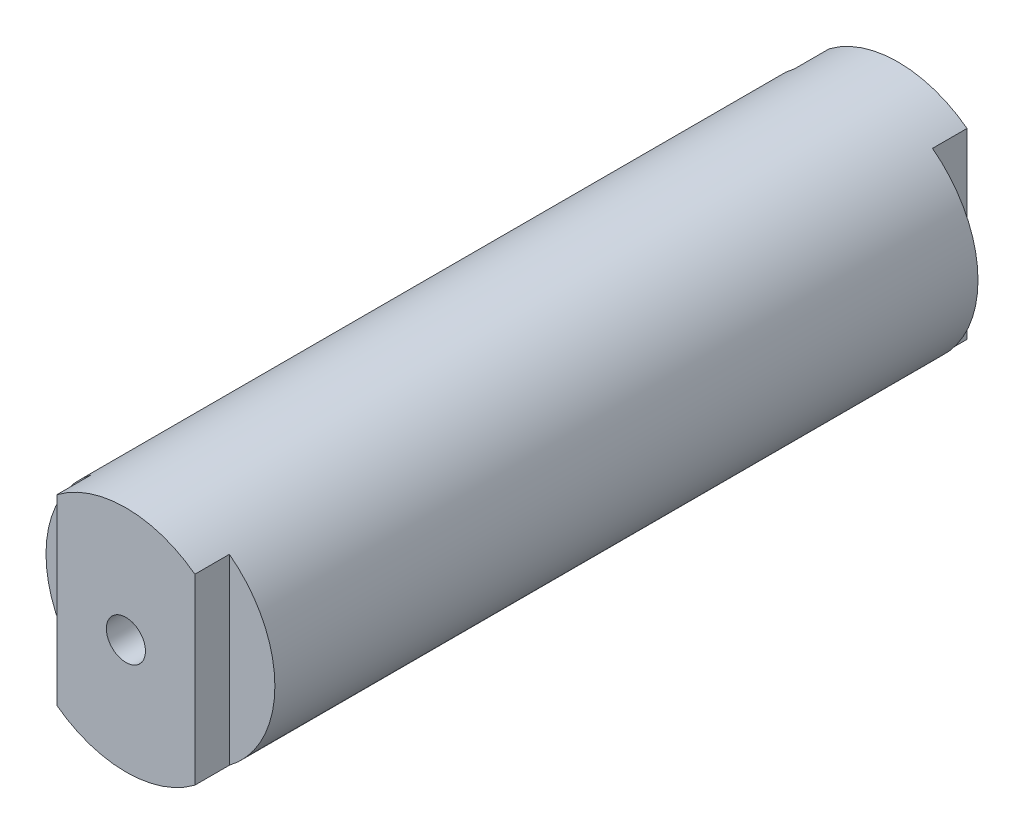
ISO-10303-21;
HEADER;
FILE_DESCRIPTION(('STEP AP214'),'2;1');
FILE_NAME('part.step','',(''),(''),'','','');
FILE_SCHEMA(('AUTOMOTIVE_DESIGN { 1 0 10303 214 1 1 1 1 }'));
ENDSEC;
DATA;
#1=APPLICATION_CONTEXT('core data for automotive mechanical design processes');
#2=APPLICATION_PROTOCOL_DEFINITION('international standard','automotive_design',2000,#1);
#3=PRODUCT_CONTEXT('',#1,'mechanical');
#4=PRODUCT('Part','Part','',(#3));
#5=PRODUCT_RELATED_PRODUCT_CATEGORY('part','',(#4));
#6=PRODUCT_DEFINITION_FORMATION('','',#4);
#7=PRODUCT_DEFINITION_CONTEXT('part definition',#1,'design');
#8=PRODUCT_DEFINITION('design','',#6,#7);
#9=PRODUCT_DEFINITION_SHAPE('','',#8);
#10=(LENGTH_UNIT() NAMED_UNIT(*) SI_UNIT(.MILLI.,.METRE.));
#11=(NAMED_UNIT(*) PLANE_ANGLE_UNIT() SI_UNIT($,.RADIAN.));
#12=(NAMED_UNIT(*) SI_UNIT($,.STERADIAN.) SOLID_ANGLE_UNIT());
#13=UNCERTAINTY_MEASURE_WITH_UNIT(LENGTH_MEASURE(1.E-05),#10,'distance_accuracy_value','');
#14=(GEOMETRIC_REPRESENTATION_CONTEXT(3) GLOBAL_UNCERTAINTY_ASSIGNED_CONTEXT((#13)) GLOBAL_UNIT_ASSIGNED_CONTEXT((#10,
#11,#12)) REPRESENTATION_CONTEXT('',''));
#15=CARTESIAN_POINT('',(0.,0.,0.));
#16=DIRECTION('',(0.,0.,1.));
#17=DIRECTION('',(1.,0.,0.));
#18=AXIS2_PLACEMENT_3D('',#15,#16,#17);
#19=CARTESIAN_POINT('',(0.,0.,88.9));
#20=DIRECTION('',(0.,0.,-1.));
#21=DIRECTION('',(-1.,0.,0.));
#22=AXIS2_PLACEMENT_3D('',#19,#20,#21);
#23=CYLINDRICAL_SURFACE('',#22,26.3525);
#24=CARTESIAN_POINT('',(0.,0.,88.9));
#25=DIRECTION('',(0.,0.,1.));
#26=DIRECTION('',(1.,0.,0.));
#27=AXIS2_PLACEMENT_3D('',#24,#25,#26);
#28=CIRCLE('',#27,26.3525);
#29=CARTESIAN_POINT('',(15.875,21.0342252353159,88.9));
#30=VERTEX_POINT('',#29);
#31=CARTESIAN_POINT('',(-15.875,21.0342252353159,88.9));
#32=VERTEX_POINT('',#31);
#33=EDGE_CURVE('E45',#30,#32,#28,.T.);
#34=ORIENTED_EDGE('',*,*,#33,.F.);
#35=DIRECTION('',(0.,0.,1.));
#36=VECTOR('',#35,1.);
#37=CARTESIAN_POINT('',(15.875,21.0342252353159,80.9498));
#38=LINE('',#37,#36);
#39=CARTESIAN_POINT('',(15.875,21.0342252353159,80.9498));
#40=VERTEX_POINT('',#39);
#41=EDGE_CURVE('E140',#40,#30,#38,.T.);
#42=ORIENTED_EDGE('',*,*,#41,.F.);
#43=CARTESIAN_POINT('',(0.,0.,80.9498));
#44=DIRECTION('',(0.,0.,1.));
#45=DIRECTION('',(1.,0.,0.));
#46=AXIS2_PLACEMENT_3D('',#43,#44,#45);
#47=CIRCLE('',#46,26.3525);
#48=CARTESIAN_POINT('',(15.875,-21.0342252353159,80.9498));
#49=VERTEX_POINT('',#48);
#50=EDGE_CURVE('E135',#49,#40,#47,.T.);
#51=ORIENTED_EDGE('',*,*,#50,.F.);
#52=DIRECTION('',(0.,0.,1.));
#53=VECTOR('',#52,1.);
#54=CARTESIAN_POINT('',(15.875,-21.0342252353159,80.9498));
#55=LINE('',#54,#53);
#56=CARTESIAN_POINT('',(15.875,-21.0342252353159,88.9));
#57=VERTEX_POINT('',#56);
#58=EDGE_CURVE('E142',#49,#57,#55,.T.);
#59=ORIENTED_EDGE('',*,*,#58,.T.);
#60=CARTESIAN_POINT('',(-15.875,-21.0342252353159,88.9));
#61=VERTEX_POINT('',#60);
#62=EDGE_CURVE('E12',#61,#57,#28,.T.);
#63=ORIENTED_EDGE('',*,*,#62,.F.);
#64=DIRECTION('',(0.,0.,1.));
#65=VECTOR('',#64,1.);
#66=CARTESIAN_POINT('',(-15.875,-21.0342252353159,80.9498));
#67=LINE('',#66,#65);
#68=CARTESIAN_POINT('',(-15.875,-21.0342252353159,80.9498));
#69=VERTEX_POINT('',#68);
#70=EDGE_CURVE('E152',#69,#61,#67,.T.);
#71=ORIENTED_EDGE('',*,*,#70,.F.);
#72=CARTESIAN_POINT('',(0.,0.,80.9498));
#73=DIRECTION('',(0.,0.,1.));
#74=DIRECTION('',(1.,0.,0.));
#75=AXIS2_PLACEMENT_3D('',#72,#73,#74);
#76=CIRCLE('',#75,26.3525);
#77=CARTESIAN_POINT('',(-15.875,21.0342252353159,80.9498));
#78=VERTEX_POINT('',#77);
#79=EDGE_CURVE('E147',#78,#69,#76,.T.);
#80=ORIENTED_EDGE('',*,*,#79,.F.);
#81=DIRECTION('',(0.,0.,1.));
#82=VECTOR('',#81,1.);
#83=CARTESIAN_POINT('',(-15.875,21.0342252353159,80.9498));
#84=LINE('',#83,#82);
#85=EDGE_CURVE('E155',#78,#32,#84,.T.);
#86=ORIENTED_EDGE('',*,*,#85,.T.);
#87=EDGE_LOOP('',(#34,#42,#51,#59,#63,#71,#80,#86));
#88=FACE_BOUND('',#87,.T.);
#89=DIRECTION('',(0.,0.,-1.));
#90=VECTOR('',#89,1.);
#91=CARTESIAN_POINT('',(15.875,-21.0342252353159,-80.9498));
#92=LINE('',#91,#90);
#93=CARTESIAN_POINT('',(15.875,-21.0342252353159,-80.9498));
#94=VERTEX_POINT('',#93);
#95=CARTESIAN_POINT('',(15.875,-21.0342252353159,-88.9));
#96=VERTEX_POINT('',#95);
#97=EDGE_CURVE('E53',#94,#96,#92,.T.);
#98=ORIENTED_EDGE('',*,*,#97,.F.);
#99=CARTESIAN_POINT('',(0.,0.,-80.9498));
#100=DIRECTION('',(0.,0.,1.));
#101=DIRECTION('',(1.,0.,0.));
#102=AXIS2_PLACEMENT_3D('',#99,#100,#101);
#103=CIRCLE('',#102,26.3525);
#104=CARTESIAN_POINT('',(15.875,21.0342252353159,-80.9498));
#105=VERTEX_POINT('',#104);
#106=EDGE_CURVE('E109',#94,#105,#103,.T.);
#107=ORIENTED_EDGE('',*,*,#106,.T.);
#108=DIRECTION('',(0.,0.,-1.));
#109=VECTOR('',#108,1.);
#110=CARTESIAN_POINT('',(15.875,21.0342252353159,-80.9498));
#111=LINE('',#110,#109);
#112=CARTESIAN_POINT('',(15.875,21.0342252353159,-88.9));
#113=VERTEX_POINT('',#112);
#114=EDGE_CURVE('E106',#105,#113,#111,.T.);
#115=ORIENTED_EDGE('',*,*,#114,.T.);
#116=CARTESIAN_POINT('',(0.,0.,-88.9));
#117=DIRECTION('',(0.,0.,1.));
#118=DIRECTION('',(1.,0.,0.));
#119=AXIS2_PLACEMENT_3D('',#116,#117,#118);
#120=CIRCLE('',#119,26.3525);
#121=CARTESIAN_POINT('',(-15.875,21.0342252353159,-88.9));
#122=VERTEX_POINT('',#121);
#123=EDGE_CURVE('E61',#113,#122,#120,.T.);
#124=ORIENTED_EDGE('',*,*,#123,.T.);
#125=DIRECTION('',(0.,0.,-1.));
#126=VECTOR('',#125,1.);
#127=CARTESIAN_POINT('',(-15.875,21.0342252353159,-80.9498));
#128=LINE('',#127,#126);
#129=CARTESIAN_POINT('',(-15.875,21.0342252353159,-80.9498));
#130=VERTEX_POINT('',#129);
#131=EDGE_CURVE('E128',#130,#122,#128,.T.);
#132=ORIENTED_EDGE('',*,*,#131,.F.);
#133=CARTESIAN_POINT('',(0.,0.,-80.9498));
#134=DIRECTION('',(0.,0.,1.));
#135=DIRECTION('',(1.,0.,0.));
#136=AXIS2_PLACEMENT_3D('',#133,#134,#135);
#137=CIRCLE('',#136,26.3525);
#138=CARTESIAN_POINT('',(-15.875,-21.0342252353159,-80.9498));
#139=VERTEX_POINT('',#138);
#140=EDGE_CURVE('E123',#130,#139,#137,.T.);
#141=ORIENTED_EDGE('',*,*,#140,.T.);
#142=DIRECTION('',(0.,0.,-1.));
#143=VECTOR('',#142,1.);
#144=CARTESIAN_POINT('',(-15.875,-21.0342252353159,-80.9498));
#145=LINE('',#144,#143);
#146=CARTESIAN_POINT('',(-15.875,-21.0342252353159,-88.9));
#147=VERTEX_POINT('',#146);
#148=EDGE_CURVE('E131',#139,#147,#145,.T.);
#149=ORIENTED_EDGE('',*,*,#148,.T.);
#150=EDGE_CURVE('E117',#147,#96,#120,.T.);
#151=ORIENTED_EDGE('',*,*,#150,.T.);
#152=EDGE_LOOP('',(#98,#107,#115,#124,#132,#141,#149,#151));
#153=FACE_BOUND('',#152,.T.);
#154=ADVANCED_FACE('F37',(#88,#153),#23,.T.);
#155=CARTESIAN_POINT('',(0.,0.,-88.9));
#156=DIRECTION('',(0.,0.,1.));
#157=DIRECTION('',(1.,0.,0.));
#158=AXIS2_PLACEMENT_3D('',#155,#156,#157);
#159=PLANE('',#158);
#160=CARTESIAN_POINT('',(0.,0.,-88.9));
#161=DIRECTION('',(0.,0.,1.));
#162=DIRECTION('',(1.,0.,0.));
#163=AXIS2_PLACEMENT_3D('',#160,#161,#162);
#164=CIRCLE('',#163,4.5);
#165=CARTESIAN_POINT('',(4.5,0.,-88.9));
#166=VERTEX_POINT('',#165);
#167=EDGE_CURVE('E198',#166,#166,#164,.T.);
#168=ORIENTED_EDGE('',*,*,#167,.T.);
#169=EDGE_LOOP('',(#168));
#170=FACE_BOUND('',#169,.T.);
#171=DIRECTION('',(0.,-1.,0.));
#172=VECTOR('',#171,1.);
#173=CARTESIAN_POINT('',(15.875,-21.0342252353159,-88.9));
#174=LINE('',#173,#172);
#175=EDGE_CURVE('E112',#113,#96,#174,.T.);
#176=ORIENTED_EDGE('',*,*,#175,.T.);
#177=ORIENTED_EDGE('',*,*,#150,.F.);
#178=DIRECTION('',(0.,1.,0.));
#179=VECTOR('',#178,1.);
#180=CARTESIAN_POINT('',(-15.875,21.0342252353159,-88.9));
#181=LINE('',#180,#179);
#182=EDGE_CURVE('E119',#147,#122,#181,.T.);
#183=ORIENTED_EDGE('',*,*,#182,.T.);
#184=ORIENTED_EDGE('',*,*,#123,.F.);
#185=EDGE_LOOP('',(#176,#177,#183,#184));
#186=FACE_BOUND('',#185,.T.);
#187=ADVANCED_FACE('F185',(#170,#186),#159,.F.);
#188=CARTESIAN_POINT('',(0.,0.,88.9));
#189=DIRECTION('',(0.,0.,1.));
#190=DIRECTION('',(1.,0.,0.));
#191=AXIS2_PLACEMENT_3D('',#188,#189,#190);
#192=PLANE('',#191);
#193=CARTESIAN_POINT('',(0.,0.,88.9));
#194=DIRECTION('',(0.,0.,1.));
#195=DIRECTION('',(1.,0.,0.));
#196=AXIS2_PLACEMENT_3D('',#193,#194,#195);
#197=CIRCLE('',#196,4.5);
#198=CARTESIAN_POINT('',(4.5,0.,88.9));
#199=VERTEX_POINT('',#198);
#200=EDGE_CURVE('E209',#199,#199,#197,.T.);
#201=ORIENTED_EDGE('',*,*,#200,.F.);
#202=EDGE_LOOP('',(#201));
#203=FACE_BOUND('',#202,.T.);
#204=DIRECTION('',(0.,-1.,0.));
#205=VECTOR('',#204,1.);
#206=CARTESIAN_POINT('',(15.875,-21.0342252353159,88.9));
#207=LINE('',#206,#205);
#208=EDGE_CURVE('E133',#30,#57,#207,.T.);
#209=ORIENTED_EDGE('',*,*,#208,.F.);
#210=ORIENTED_EDGE('',*,*,#33,.T.);
#211=DIRECTION('',(0.,1.,0.));
#212=VECTOR('',#211,1.);
#213=CARTESIAN_POINT('',(-15.875,21.0342252353159,88.9));
#214=LINE('',#213,#212);
#215=EDGE_CURVE('E145',#61,#32,#214,.T.);
#216=ORIENTED_EDGE('',*,*,#215,.F.);
#217=ORIENTED_EDGE('',*,*,#62,.T.);
#218=EDGE_LOOP('',(#209,#210,#216,#217));
#219=FACE_BOUND('',#218,.T.);
#220=ADVANCED_FACE('F162',(#203,#219),#192,.T.);
#221=CARTESIAN_POINT('',(-15.875,21.0342252353159,80.9498));
#222=DIRECTION('',(1.,0.,0.));
#223=DIRECTION('',(0.,0.,-1.));
#224=AXIS2_PLACEMENT_3D('',#221,#222,#223);
#225=PLANE('',#224);
#226=ORIENTED_EDGE('',*,*,#215,.T.);
#227=ORIENTED_EDGE('',*,*,#85,.F.);
#228=DIRECTION('',(0.,1.,0.));
#229=VECTOR('',#228,1.);
#230=CARTESIAN_POINT('',(-15.875,21.0342252353159,80.9498));
#231=LINE('',#230,#229);
#232=EDGE_CURVE('E149',#69,#78,#231,.T.);
#233=ORIENTED_EDGE('',*,*,#232,.F.);
#234=ORIENTED_EDGE('',*,*,#70,.T.);
#235=EDGE_LOOP('',(#226,#227,#233,#234));
#236=FACE_BOUND('',#235,.T.);
#237=ADVANCED_FACE('F167',(#236),#225,.F.);
#238=CARTESIAN_POINT('',(0.,0.,80.9498));
#239=DIRECTION('',(0.,0.,1.));
#240=DIRECTION('',(1.,0.,0.));
#241=AXIS2_PLACEMENT_3D('',#238,#239,#240);
#242=PLANE('',#241);
#243=ORIENTED_EDGE('',*,*,#79,.T.);
#244=ORIENTED_EDGE('',*,*,#232,.T.);
#245=EDGE_LOOP('',(#243,#244));
#246=FACE_BOUND('',#245,.T.);
#247=ADVANCED_FACE('F172',(#246),#242,.T.);
#248=CARTESIAN_POINT('',(15.875,-21.0342252353159,80.9498));
#249=DIRECTION('',(-1.,0.,0.));
#250=DIRECTION('',(0.,0.,1.));
#251=AXIS2_PLACEMENT_3D('',#248,#249,#250);
#252=PLANE('',#251);
#253=ORIENTED_EDGE('',*,*,#208,.T.);
#254=ORIENTED_EDGE('',*,*,#58,.F.);
#255=DIRECTION('',(0.,-1.,0.));
#256=VECTOR('',#255,1.);
#257=CARTESIAN_POINT('',(15.875,-21.0342252353159,80.9498));
#258=LINE('',#257,#256);
#259=EDGE_CURVE('E137',#40,#49,#258,.T.);
#260=ORIENTED_EDGE('',*,*,#259,.F.);
#261=ORIENTED_EDGE('',*,*,#41,.T.);
#262=EDGE_LOOP('',(#253,#254,#260,#261));
#263=FACE_BOUND('',#262,.T.);
#264=ADVANCED_FACE('F174',(#263),#252,.F.);
#265=CARTESIAN_POINT('',(0.,0.,80.9498));
#266=DIRECTION('',(0.,0.,1.));
#267=DIRECTION('',(1.,0.,0.));
#268=AXIS2_PLACEMENT_3D('',#265,#266,#267);
#269=PLANE('',#268);
#270=ORIENTED_EDGE('',*,*,#50,.T.);
#271=ORIENTED_EDGE('',*,*,#259,.T.);
#272=EDGE_LOOP('',(#270,#271));
#273=FACE_BOUND('',#272,.T.);
#274=ADVANCED_FACE('F180',(#273),#269,.T.);
#275=CARTESIAN_POINT('',(-15.875,21.0342252353159,-80.9498));
#276=DIRECTION('',(-1.,0.,0.));
#277=DIRECTION('',(0.,0.,1.));
#278=AXIS2_PLACEMENT_3D('',#275,#276,#277);
#279=PLANE('',#278);
#280=ORIENTED_EDGE('',*,*,#182,.F.);
#281=ORIENTED_EDGE('',*,*,#148,.F.);
#282=DIRECTION('',(0.,1.,0.));
#283=VECTOR('',#282,1.);
#284=CARTESIAN_POINT('',(-15.875,21.0342252353159,-80.9498));
#285=LINE('',#284,#283);
#286=EDGE_CURVE('E126',#139,#130,#285,.T.);
#287=ORIENTED_EDGE('',*,*,#286,.T.);
#288=ORIENTED_EDGE('',*,*,#131,.T.);
#289=EDGE_LOOP('',(#280,#281,#287,#288));
#290=FACE_BOUND('',#289,.T.);
#291=ADVANCED_FACE('F245',(#290),#279,.T.);
#292=CARTESIAN_POINT('',(0.,0.,-80.9498));
#293=DIRECTION('',(0.,0.,-1.));
#294=DIRECTION('',(1.,0.,0.));
#295=AXIS2_PLACEMENT_3D('',#292,#293,#294);
#296=PLANE('',#295);
#297=ORIENTED_EDGE('',*,*,#140,.F.);
#298=ORIENTED_EDGE('',*,*,#286,.F.);
#299=EDGE_LOOP('',(#297,#298));
#300=FACE_BOUND('',#299,.T.);
#301=ADVANCED_FACE('F242',(#300),#296,.T.);
#302=CARTESIAN_POINT('',(15.875,-21.0342252353159,-80.9498));
#303=DIRECTION('',(1.,0.,0.));
#304=DIRECTION('',(0.,0.,-1.));
#305=AXIS2_PLACEMENT_3D('',#302,#303,#304);
#306=PLANE('',#305);
#307=ORIENTED_EDGE('',*,*,#175,.F.);
#308=ORIENTED_EDGE('',*,*,#114,.F.);
#309=DIRECTION('',(0.,-1.,0.));
#310=VECTOR('',#309,1.);
#311=CARTESIAN_POINT('',(15.875,-21.0342252353159,-80.9498));
#312=LINE('',#311,#310);
#313=EDGE_CURVE('E103',#105,#94,#312,.T.);
#314=ORIENTED_EDGE('',*,*,#313,.T.);
#315=ORIENTED_EDGE('',*,*,#97,.T.);
#316=EDGE_LOOP('',(#307,#308,#314,#315));
#317=FACE_BOUND('',#316,.T.);
#318=ADVANCED_FACE('F105',(#317),#306,.T.);
#319=CARTESIAN_POINT('',(0.,0.,-80.9498));
#320=DIRECTION('',(0.,0.,-1.));
#321=DIRECTION('',(1.,0.,0.));
#322=AXIS2_PLACEMENT_3D('',#319,#320,#321);
#323=PLANE('',#322);
#324=ORIENTED_EDGE('',*,*,#106,.F.);
#325=ORIENTED_EDGE('',*,*,#313,.F.);
#326=EDGE_LOOP('',(#324,#325));
#327=FACE_BOUND('',#326,.T.);
#328=ADVANCED_FACE('F111',(#327),#323,.T.);
#329=CARTESIAN_POINT('',(0.,0.,-88.9));
#330=DIRECTION('',(0.,0.,1.));
#331=DIRECTION('',(1.,0.,0.));
#332=AXIS2_PLACEMENT_3D('',#329,#330,#331);
#333=CYLINDRICAL_SURFACE('',#332,4.5);
#334=ORIENTED_EDGE('',*,*,#200,.T.);
#335=EDGE_LOOP('',(#334));
#336=FACE_BOUND('',#335,.T.);
#337=CARTESIAN_POINT('',(0.,0.,77.9498));
#338=DIRECTION('',(0.,0.,1.));
#339=DIRECTION('',(1.,0.,0.));
#340=AXIS2_PLACEMENT_3D('',#337,#338,#339);
#341=CIRCLE('',#340,4.5);
#342=CARTESIAN_POINT('',(4.5,0.,77.9498));
#343=VERTEX_POINT('',#342);
#344=EDGE_CURVE('E40',#343,#343,#341,.T.);
#345=ORIENTED_EDGE('',*,*,#344,.F.);
#346=EDGE_LOOP('',(#345));
#347=FACE_BOUND('',#346,.T.);
#348=ADVANCED_FACE('F218',(#336,#347),#333,.F.);
#349=ORIENTED_EDGE('',*,*,#167,.F.);
#350=EDGE_LOOP('',(#349));
#351=FACE_BOUND('',#350,.T.);
#352=CARTESIAN_POINT('',(0.,0.,-77.9498));
#353=DIRECTION('',(0.,0.,-1.));
#354=DIRECTION('',(-1.,0.,0.));
#355=AXIS2_PLACEMENT_3D('',#352,#353,#354);
#356=CIRCLE('',#355,4.5);
#357=CARTESIAN_POINT('',(-4.5,0.,-77.9498));
#358=VERTEX_POINT('',#357);
#359=EDGE_CURVE('E206',#358,#358,#356,.T.);
#360=ORIENTED_EDGE('',*,*,#359,.F.);
#361=EDGE_LOOP('',(#360));
#362=FACE_BOUND('',#361,.T.);
#363=ADVANCED_FACE('F220',(#351,#362),#333,.F.);
#364=CARTESIAN_POINT('',(0.,0.,-77.9498));
#365=DIRECTION('',(0.,0.,-1.));
#366=DIRECTION('',(1.,0.,0.));
#367=AXIS2_PLACEMENT_3D('',#364,#365,#366);
#368=PLANE('',#367);
#369=ORIENTED_EDGE('',*,*,#359,.T.);
#370=EDGE_LOOP('',(#369));
#371=FACE_BOUND('',#370,.T.);
#372=CARTESIAN_POINT('',(0.,0.,-77.9498));
#373=DIRECTION('',(0.,0.,-1.));
#374=DIRECTION('',(-1.,0.,0.));
#375=AXIS2_PLACEMENT_3D('',#372,#373,#374);
#376=CIRCLE('',#375,22.86);
#377=CARTESIAN_POINT('',(-22.86,0.,-77.9498));
#378=VERTEX_POINT('',#377);
#379=EDGE_CURVE('E199',#378,#378,#376,.F.);
#380=ORIENTED_EDGE('',*,*,#379,.T.);
#381=EDGE_LOOP('',(#380));
#382=FACE_BOUND('',#381,.T.);
#383=ADVANCED_FACE('F227',(#371,#382),#368,.F.);
#384=CARTESIAN_POINT('',(0.,0.,77.9498));
#385=DIRECTION('',(0.,0.,1.));
#386=DIRECTION('',(1.,0.,0.));
#387=AXIS2_PLACEMENT_3D('',#384,#385,#386);
#388=PLANE('',#387);
#389=ORIENTED_EDGE('',*,*,#344,.T.);
#390=EDGE_LOOP('',(#389));
#391=FACE_BOUND('',#390,.T.);
#392=CARTESIAN_POINT('',(0.,0.,77.9498));
#393=DIRECTION('',(0.,0.,1.));
#394=DIRECTION('',(1.,0.,0.));
#395=AXIS2_PLACEMENT_3D('',#392,#393,#394);
#396=CIRCLE('',#395,22.86);
#397=CARTESIAN_POINT('',(22.86,0.,77.9498));
#398=VERTEX_POINT('',#397);
#399=EDGE_CURVE('E201',#398,#398,#396,.T.);
#400=ORIENTED_EDGE('',*,*,#399,.F.);
#401=EDGE_LOOP('',(#400));
#402=FACE_BOUND('',#401,.T.);
#403=ADVANCED_FACE('F215',(#391,#402),#388,.F.);
#404=CARTESIAN_POINT('',(0.,0.,-145.607644071698));
#405=DIRECTION('',(0.,0.,1.));
#406=DIRECTION('',(1.,0.,0.));
#407=AXIS2_PLACEMENT_3D('',#404,#405,#406);
#408=CYLINDRICAL_SURFACE('',#407,22.86);
#409=ORIENTED_EDGE('',*,*,#399,.T.);
#410=EDGE_LOOP('',(#409));
#411=FACE_BOUND('',#410,.T.);
#412=ORIENTED_EDGE('',*,*,#379,.F.);
#413=EDGE_LOOP('',(#412));
#414=FACE_BOUND('',#413,.T.);
#415=ADVANCED_FACE('F233',(#411,#414),#408,.F.);
#416=CLOSED_SHELL('',(#154,#187,#220,#237,#247,#264,#274,#291,#301,#318,#328,#348,#363,#383,
#403,#415));
#417=MANIFOLD_SOLID_BREP('B2',#416);
#418=ADVANCED_BREP_SHAPE_REPRESENTATION('',(#18,#417),#14);
#419=SHAPE_DEFINITION_REPRESENTATION(#9,#418);
ENDSEC;
END-ISO-10303-21;
